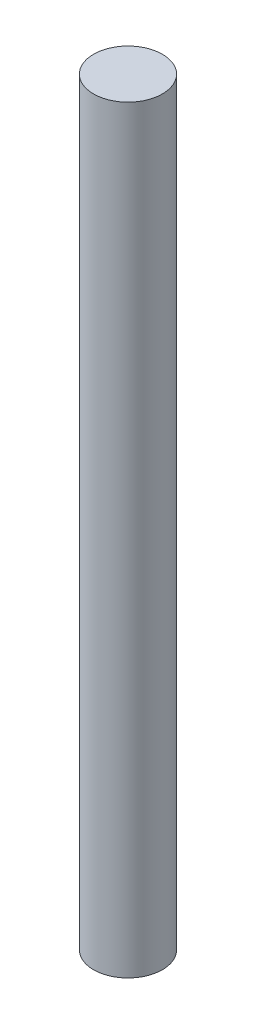
ISO-10303-21;
HEADER;
FILE_DESCRIPTION(('STEP AP214'),'2;1');
FILE_NAME('part.step','',(''),(''),'','','');
FILE_SCHEMA(('AUTOMOTIVE_DESIGN { 1 0 10303 214 1 1 1 1 }'));
ENDSEC;
DATA;
#1=APPLICATION_CONTEXT('core data for automotive mechanical design processes');
#2=APPLICATION_PROTOCOL_DEFINITION('international standard','automotive_design',2000,#1);
#3=PRODUCT_CONTEXT('',#1,'mechanical');
#4=PRODUCT('Part','Part','',(#3));
#5=PRODUCT_RELATED_PRODUCT_CATEGORY('part','',(#4));
#6=PRODUCT_DEFINITION_FORMATION('','',#4);
#7=PRODUCT_DEFINITION_CONTEXT('part definition',#1,'design');
#8=PRODUCT_DEFINITION('design','',#6,#7);
#9=PRODUCT_DEFINITION_SHAPE('','',#8);
#10=(LENGTH_UNIT() NAMED_UNIT(*) SI_UNIT(.MILLI.,.METRE.));
#11=(NAMED_UNIT(*) PLANE_ANGLE_UNIT() SI_UNIT($,.RADIAN.));
#12=(NAMED_UNIT(*) SI_UNIT($,.STERADIAN.) SOLID_ANGLE_UNIT());
#13=UNCERTAINTY_MEASURE_WITH_UNIT(LENGTH_MEASURE(1.E-05),#10,'distance_accuracy_value','');
#14=(GEOMETRIC_REPRESENTATION_CONTEXT(3) GLOBAL_UNCERTAINTY_ASSIGNED_CONTEXT((#13)) GLOBAL_UNIT_ASSIGNED_CONTEXT((#10,
#11,#12)) REPRESENTATION_CONTEXT('',''));
#15=CARTESIAN_POINT('',(0.,0.,0.));
#16=DIRECTION('',(0.,0.,1.));
#17=DIRECTION('',(1.,0.,0.));
#18=AXIS2_PLACEMENT_3D('',#15,#16,#17);
#19=CARTESIAN_POINT('',(0.,70.,0.));
#20=DIRECTION('',(0.,-1.,0.));
#21=DIRECTION('',(0.,0.,-1.));
#22=AXIS2_PLACEMENT_3D('',#19,#20,#21);
#23=CYLINDRICAL_SURFACE('',#22,3.175);
#24=CARTESIAN_POINT('',(0.,70.,0.));
#25=DIRECTION('',(0.,1.,0.));
#26=DIRECTION('',(0.,0.,1.));
#27=AXIS2_PLACEMENT_3D('',#24,#25,#26);
#28=CIRCLE('',#27,3.175);
#29=CARTESIAN_POINT('',(0.,70.,3.175));
#30=VERTEX_POINT('',#29);
#31=EDGE_CURVE('E10',#30,#30,#28,.T.);
#32=ORIENTED_EDGE('',*,*,#31,.F.);
#33=EDGE_LOOP('',(#32));
#34=FACE_BOUND('',#33,.T.);
#35=CARTESIAN_POINT('',(0.,0.,0.));
#36=DIRECTION('',(0.,1.,0.));
#37=DIRECTION('',(0.,0.,1.));
#38=AXIS2_PLACEMENT_3D('',#35,#36,#37);
#39=CIRCLE('',#38,3.175);
#40=CARTESIAN_POINT('',(0.,0.,3.175));
#41=VERTEX_POINT('',#40);
#42=EDGE_CURVE('E34',#41,#41,#39,.T.);
#43=ORIENTED_EDGE('',*,*,#42,.T.);
#44=EDGE_LOOP('',(#43));
#45=FACE_BOUND('',#44,.T.);
#46=ADVANCED_FACE('F31',(#34,#45),#23,.T.);
#47=CARTESIAN_POINT('',(0.,70.,0.));
#48=DIRECTION('',(0.,1.,0.));
#49=DIRECTION('',(0.,0.,1.));
#50=AXIS2_PLACEMENT_3D('',#47,#48,#49);
#51=PLANE('',#50);
#52=ORIENTED_EDGE('',*,*,#31,.T.);
#53=EDGE_LOOP('',(#52));
#54=FACE_BOUND('',#53,.T.);
#55=ADVANCED_FACE('F46',(#54),#51,.T.);
#56=CARTESIAN_POINT('',(0.,0.,0.));
#57=DIRECTION('',(0.,1.,0.));
#58=DIRECTION('',(0.,0.,1.));
#59=AXIS2_PLACEMENT_3D('',#56,#57,#58);
#60=PLANE('',#59);
#61=ORIENTED_EDGE('',*,*,#42,.F.);
#62=EDGE_LOOP('',(#61));
#63=FACE_BOUND('',#62,.T.);
#64=ADVANCED_FACE('F44',(#63),#60,.F.);
#65=CLOSED_SHELL('',(#46,#55,#64));
#66=MANIFOLD_SOLID_BREP('B2',#65);
#67=ADVANCED_BREP_SHAPE_REPRESENTATION('',(#18,#66),#14);
#68=SHAPE_DEFINITION_REPRESENTATION(#9,#67);
ENDSEC;
END-ISO-10303-21;
